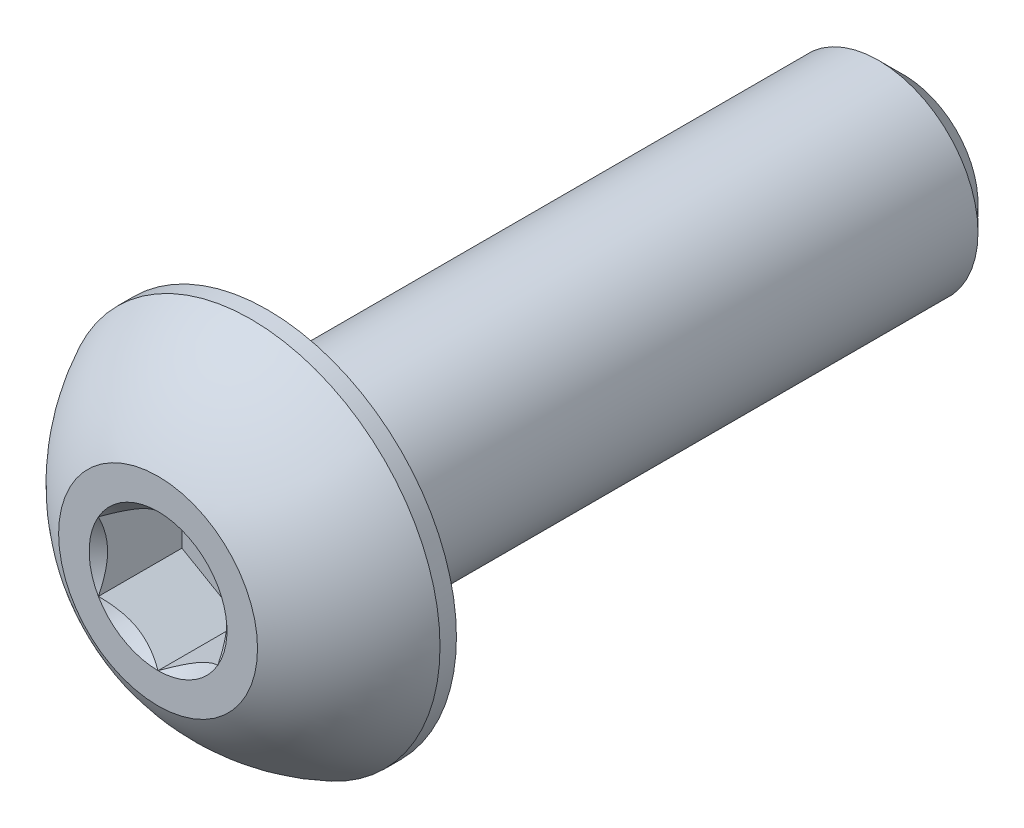
ISO-10303-21;
HEADER;
FILE_DESCRIPTION(('STEP AP214'),'2;1');
FILE_NAME('part.step','',(''),(''),'','','');
FILE_SCHEMA(('AUTOMOTIVE_DESIGN { 1 0 10303 214 1 1 1 1 }'));
ENDSEC;
DATA;
#1=APPLICATION_CONTEXT('core data for automotive mechanical design processes');
#2=APPLICATION_PROTOCOL_DEFINITION('international standard','automotive_design',2000,#1);
#3=PRODUCT_CONTEXT('',#1,'mechanical');
#4=PRODUCT('Part','Part','',(#3));
#5=PRODUCT_RELATED_PRODUCT_CATEGORY('part','',(#4));
#6=PRODUCT_DEFINITION_FORMATION('','',#4);
#7=PRODUCT_DEFINITION_CONTEXT('part definition',#1,'design');
#8=PRODUCT_DEFINITION('design','',#6,#7);
#9=PRODUCT_DEFINITION_SHAPE('','',#8);
#10=(LENGTH_UNIT() NAMED_UNIT(*) SI_UNIT(.MILLI.,.METRE.));
#11=(NAMED_UNIT(*) PLANE_ANGLE_UNIT() SI_UNIT($,.RADIAN.));
#12=(NAMED_UNIT(*) SI_UNIT($,.STERADIAN.) SOLID_ANGLE_UNIT());
#13=UNCERTAINTY_MEASURE_WITH_UNIT(LENGTH_MEASURE(1.E-05),#10,'distance_accuracy_value','');
#14=(GEOMETRIC_REPRESENTATION_CONTEXT(3) GLOBAL_UNCERTAINTY_ASSIGNED_CONTEXT((#13)) GLOBAL_UNIT_ASSIGNED_CONTEXT((#10,
#11,#12)) REPRESENTATION_CONTEXT('',''));
#15=CARTESIAN_POINT('',(0.,0.,0.));
#16=DIRECTION('',(0.,0.,1.));
#17=DIRECTION('',(1.,0.,0.));
#18=AXIS2_PLACEMENT_3D('',#15,#16,#17);
#19=CARTESIAN_POINT('',(1.5,0.866025403784439,7.275));
#20=DIRECTION('',(0.5,0.866025403784439,0.));
#21=DIRECTION('',(0.,0.,-1.));
#22=AXIS2_PLACEMENT_3D('',#19,#20,#21);
#23=PLANE('',#22);
#24=DIRECTION('',(0.,0.,1.));
#25=VECTOR('',#24,1.);
#26=CARTESIAN_POINT('',(1.5,0.866025403784439,7.275));
#27=LINE('',#26,#25);
#28=CARTESIAN_POINT('',(1.5,0.866025403784439,7.275));
#29=VERTEX_POINT('',#28);
#30=CARTESIAN_POINT('',(1.5,0.866025403784439,9.375));
#31=VERTEX_POINT('',#30);
#32=EDGE_CURVE('E11',#29,#31,#27,.T.);
#33=ORIENTED_EDGE('',*,*,#32,.T.);
#34=CARTESIAN_POINT('',(1.5,0.866025403784441,9.37499999999999));
#35=CARTESIAN_POINT('',(0.749999999999999,1.29903810567666,8.94198729810777));
#36=CARTESIAN_POINT('',(0.,1.73205080756888,9.375));
#37=(BOUNDED_CURVE() B_SPLINE_CURVE(2,(#34,#35,#36),.UNSPECIFIED.,.F.,
.F.) B_SPLINE_CURVE_WITH_KNOTS((3,3),(-0.38831280429231,-0.130611113351457),
.UNSPECIFIED.) CURVE() GEOMETRIC_REPRESENTATION_ITEM() RATIONAL_B_SPLINE_CURVE((1.30940107675851,
1.51196612828742,1.3094010767585)) REPRESENTATION_ITEM(''));
#38=CARTESIAN_POINT('',(0.,1.73205080756888,9.375));
#39=VERTEX_POINT('',#38);
#40=EDGE_CURVE('E124',#31,#39,#37,.T.);
#41=ORIENTED_EDGE('',*,*,#40,.T.);
#42=DIRECTION('',(0.,0.,1.));
#43=VECTOR('',#42,1.);
#44=CARTESIAN_POINT('',(0.,1.73205080756888,7.275));
#45=LINE('',#44,#43);
#46=CARTESIAN_POINT('',(0.,1.73205080756888,7.275));
#47=VERTEX_POINT('',#46);
#48=EDGE_CURVE('E202',#47,#39,#45,.T.);
#49=ORIENTED_EDGE('',*,*,#48,.F.);
#50=DIRECTION('',(-0.866025403784439,0.5,0.));
#51=VECTOR('',#50,1.);
#52=CARTESIAN_POINT('',(1.5,0.866025403784439,7.275));
#53=LINE('',#52,#51);
#54=EDGE_CURVE('E242',#29,#47,#53,.T.);
#55=ORIENTED_EDGE('',*,*,#54,.F.);
#56=EDGE_LOOP('',(#33,#41,#49,#55));
#57=FACE_BOUND('',#56,.T.);
#58=ADVANCED_FACE('F17',(#57),#23,.F.);
#59=CARTESIAN_POINT('',(1.5,-0.866025403784439,7.275));
#60=DIRECTION('',(1.,0.,0.));
#61=DIRECTION('',(0.,-1.,0.));
#62=AXIS2_PLACEMENT_3D('',#59,#60,#61);
#63=PLANE('',#62);
#64=DIRECTION('',(0.,0.,1.));
#65=VECTOR('',#64,1.);
#66=CARTESIAN_POINT('',(1.5,-0.866025403784439,7.275));
#67=LINE('',#66,#65);
#68=CARTESIAN_POINT('',(1.5,-0.866025403784439,7.275));
#69=VERTEX_POINT('',#68);
#70=CARTESIAN_POINT('',(1.5,-0.866025403784439,9.375));
#71=VERTEX_POINT('',#70);
#72=EDGE_CURVE('E20',#69,#71,#67,.T.);
#73=ORIENTED_EDGE('',*,*,#72,.T.);
#74=CARTESIAN_POINT('',(1.5,-0.86602540378444,9.375));
#75=CARTESIAN_POINT('',(1.5,0.,8.94198729810777));
#76=CARTESIAN_POINT('',(1.5,0.86602540378444,9.375));
#77=(BOUNDED_CURVE() B_SPLINE_CURVE(2,(#74,#75,#76),.UNSPECIFIED.,.F.,
.F.) B_SPLINE_CURVE_WITH_KNOTS((3,3),(-0.388312804292311,-0.130611113351457),
.UNSPECIFIED.) CURVE() GEOMETRIC_REPRESENTATION_ITEM() RATIONAL_B_SPLINE_CURVE((1.3094010767585,
1.51196612828742,1.3094010767585)) REPRESENTATION_ITEM(''));
#78=EDGE_CURVE('E113',#71,#31,#77,.T.);
#79=ORIENTED_EDGE('',*,*,#78,.T.);
#80=ORIENTED_EDGE('',*,*,#32,.F.);
#81=DIRECTION('',(0.,1.,0.));
#82=VECTOR('',#81,1.);
#83=CARTESIAN_POINT('',(1.5,-0.866025403784439,7.275));
#84=LINE('',#83,#82);
#85=EDGE_CURVE('E115',#69,#29,#84,.T.);
#86=ORIENTED_EDGE('',*,*,#85,.F.);
#87=EDGE_LOOP('',(#73,#79,#80,#86));
#88=FACE_BOUND('',#87,.T.);
#89=ADVANCED_FACE('F111',(#88),#63,.F.);
#90=CARTESIAN_POINT('',(0.,-1.73205080756888,7.275));
#91=DIRECTION('',(0.5,-0.866025403784439,0.));
#92=DIRECTION('',(0.,0.,-1.));
#93=AXIS2_PLACEMENT_3D('',#90,#91,#92);
#94=PLANE('',#93);
#95=DIRECTION('',(0.,0.,1.));
#96=VECTOR('',#95,1.);
#97=CARTESIAN_POINT('',(0.,-1.73205080756888,7.275));
#98=LINE('',#97,#96);
#99=CARTESIAN_POINT('',(0.,-1.73205080756888,7.275));
#100=VERTEX_POINT('',#99);
#101=CARTESIAN_POINT('',(0.,-1.73205080756888,9.375));
#102=VERTEX_POINT('',#101);
#103=EDGE_CURVE('E47',#100,#102,#98,.T.);
#104=ORIENTED_EDGE('',*,*,#103,.T.);
#105=CARTESIAN_POINT('',(0.,-1.73205080756888,9.375));
#106=CARTESIAN_POINT('',(0.749999999999998,-1.29903810567666,8.94198729810777));
#107=CARTESIAN_POINT('',(1.5,-0.86602540378444,9.375));
#108=(BOUNDED_CURVE() B_SPLINE_CURVE(2,(#105,#106,#107),.UNSPECIFIED.,.F.,
.F.) B_SPLINE_CURVE_WITH_KNOTS((3,3),(-0.388312804292312,-0.130611113351457),
.UNSPECIFIED.) CURVE() GEOMETRIC_REPRESENTATION_ITEM() RATIONAL_B_SPLINE_CURVE((1.3094010767585,
1.51196612828742,1.3094010767585)) REPRESENTATION_ITEM(''));
#109=EDGE_CURVE('E119',#102,#71,#108,.T.);
#110=ORIENTED_EDGE('',*,*,#109,.T.);
#111=ORIENTED_EDGE('',*,*,#72,.F.);
#112=DIRECTION('',(0.866025403784439,0.5,0.));
#113=VECTOR('',#112,1.);
#114=CARTESIAN_POINT('',(0.,-1.73205080756888,7.275));
#115=LINE('',#114,#113);
#116=EDGE_CURVE('E261',#100,#69,#115,.T.);
#117=ORIENTED_EDGE('',*,*,#116,.F.);
#118=EDGE_LOOP('',(#104,#110,#111,#117));
#119=FACE_BOUND('',#118,.T.);
#120=ADVANCED_FACE('F121',(#119),#94,.F.);
#121=CARTESIAN_POINT('',(-1.5,-0.866025403784438,7.275));
#122=DIRECTION('',(-0.5,-0.866025403784439,0.));
#123=DIRECTION('',(-0.866025403784439,0.5,0.));
#124=AXIS2_PLACEMENT_3D('',#121,#122,#123);
#125=PLANE('',#124);
#126=DIRECTION('',(0.,0.,1.));
#127=VECTOR('',#126,1.);
#128=CARTESIAN_POINT('',(-1.5,-0.866025403784438,7.275));
#129=LINE('',#128,#127);
#130=CARTESIAN_POINT('',(-1.5,-0.866025403784438,7.275));
#131=VERTEX_POINT('',#130);
#132=CARTESIAN_POINT('',(-1.5,-0.866025403784439,9.375));
#133=VERTEX_POINT('',#132);
#134=EDGE_CURVE('E262',#131,#133,#129,.T.);
#135=ORIENTED_EDGE('',*,*,#134,.T.);
#136=CARTESIAN_POINT('',(-1.5,-0.866025403784438,9.375));
#137=CARTESIAN_POINT('',(-0.749999999999999,-1.29903810567666,8.94198729810777));
#138=CARTESIAN_POINT('',(0.,-1.73205080756888,9.375));
#139=(BOUNDED_CURVE() B_SPLINE_CURVE(2,(#136,#137,#138),.UNSPECIFIED.,.F.,
.F.) B_SPLINE_CURVE_WITH_KNOTS((3,3),(-0.388312804292311,-0.130611113351457),
.UNSPECIFIED.) CURVE() GEOMETRIC_REPRESENTATION_ITEM() RATIONAL_B_SPLINE_CURVE((1.3094010767585,
1.51196612828742,1.3094010767585)) REPRESENTATION_ITEM(''));
#140=EDGE_CURVE('E125',#133,#102,#139,.T.);
#141=ORIENTED_EDGE('',*,*,#140,.T.);
#142=ORIENTED_EDGE('',*,*,#103,.F.);
#143=DIRECTION('',(0.866025403784439,-0.5,0.));
#144=VECTOR('',#143,1.);
#145=CARTESIAN_POINT('',(-1.5,-0.866025403784438,7.275));
#146=LINE('',#145,#144);
#147=EDGE_CURVE('E257',#131,#100,#146,.T.);
#148=ORIENTED_EDGE('',*,*,#147,.F.);
#149=EDGE_LOOP('',(#135,#141,#142,#148));
#150=FACE_BOUND('',#149,.T.);
#151=ADVANCED_FACE('F524',(#150),#125,.F.);
#152=CARTESIAN_POINT('',(-1.5,0.866025403784439,7.275));
#153=DIRECTION('',(-1.,0.,0.));
#154=DIRECTION('',(0.,0.,1.));
#155=AXIS2_PLACEMENT_3D('',#152,#153,#154);
#156=PLANE('',#155);
#157=DIRECTION('',(0.,0.,1.));
#158=VECTOR('',#157,1.);
#159=CARTESIAN_POINT('',(-1.5,0.866025403784439,7.275));
#160=LINE('',#159,#158);
#161=CARTESIAN_POINT('',(-1.5,0.866025403784439,7.275));
#162=VERTEX_POINT('',#161);
#163=CARTESIAN_POINT('',(-1.5,0.866025403784439,9.375));
#164=VERTEX_POINT('',#163);
#165=EDGE_CURVE('E205',#162,#164,#160,.T.);
#166=ORIENTED_EDGE('',*,*,#165,.T.);
#167=CARTESIAN_POINT('',(-1.5,0.866025403784437,9.375));
#168=CARTESIAN_POINT('',(-1.5,0.,8.94198729810777));
#169=CARTESIAN_POINT('',(-1.5,-0.866025403784438,9.375));
#170=(BOUNDED_CURVE() B_SPLINE_CURVE(2,(#167,#168,#169),.UNSPECIFIED.,.F.,
.F.) B_SPLINE_CURVE_WITH_KNOTS((3,3),(-0.388312804292311,-0.130611113351457),
.UNSPECIFIED.) CURVE() GEOMETRIC_REPRESENTATION_ITEM() RATIONAL_B_SPLINE_CURVE((1.3094010767585,
1.51196612828742,1.3094010767585)) REPRESENTATION_ITEM(''));
#171=EDGE_CURVE('E213',#164,#133,#170,.T.);
#172=ORIENTED_EDGE('',*,*,#171,.T.);
#173=ORIENTED_EDGE('',*,*,#134,.F.);
#174=DIRECTION('',(0.,-1.,0.));
#175=VECTOR('',#174,1.);
#176=CARTESIAN_POINT('',(-1.5,0.866025403784439,7.275));
#177=LINE('',#176,#175);
#178=EDGE_CURVE('E253',#162,#131,#177,.T.);
#179=ORIENTED_EDGE('',*,*,#178,.F.);
#180=EDGE_LOOP('',(#166,#172,#173,#179));
#181=FACE_BOUND('',#180,.T.);
#182=ADVANCED_FACE('F515',(#181),#156,.F.);
#183=CARTESIAN_POINT('',(0.,1.73205080756888,7.275));
#184=DIRECTION('',(-0.5,0.866025403784439,0.));
#185=DIRECTION('',(0.,0.,1.));
#186=AXIS2_PLACEMENT_3D('',#183,#184,#185);
#187=PLANE('',#186);
#188=ORIENTED_EDGE('',*,*,#48,.T.);
#189=CARTESIAN_POINT('',(0.,1.73205080756888,9.375));
#190=CARTESIAN_POINT('',(-0.749999999999999,1.29903810567666,8.94198729810777));
#191=CARTESIAN_POINT('',(-1.5,0.86602540378444,9.375));
#192=(BOUNDED_CURVE() B_SPLINE_CURVE(2,(#189,#190,#191),.UNSPECIFIED.,.F.,
.F.) B_SPLINE_CURVE_WITH_KNOTS((3,3),(-0.388312804292311,-0.130611113351457),
.UNSPECIFIED.) CURVE() GEOMETRIC_REPRESENTATION_ITEM() RATIONAL_B_SPLINE_CURVE((1.3094010767585,
1.51196612828742,1.3094010767585)) REPRESENTATION_ITEM(''));
#193=EDGE_CURVE('E190',#39,#164,#192,.T.);
#194=ORIENTED_EDGE('',*,*,#193,.T.);
#195=ORIENTED_EDGE('',*,*,#165,.F.);
#196=DIRECTION('',(-0.866025403784439,-0.5,0.));
#197=VECTOR('',#196,1.);
#198=CARTESIAN_POINT('',(0.,1.73205080756888,7.275));
#199=LINE('',#198,#197);
#200=EDGE_CURVE('E249',#47,#162,#199,.T.);
#201=ORIENTED_EDGE('',*,*,#200,.F.);
#202=EDGE_LOOP('',(#188,#194,#195,#201));
#203=FACE_BOUND('',#202,.T.);
#204=ADVANCED_FACE('F505',(#203),#187,.F.);
#205=CARTESIAN_POINT('',(0.,0.,7.275));
#206=DIRECTION('',(0.,0.,1.));
#207=DIRECTION('',(1.,0.,0.));
#208=AXIS2_PLACEMENT_3D('',#205,#206,#207);
#209=PLANE('',#208);
#210=ORIENTED_EDGE('',*,*,#54,.T.);
#211=ORIENTED_EDGE('',*,*,#200,.T.);
#212=ORIENTED_EDGE('',*,*,#178,.T.);
#213=ORIENTED_EDGE('',*,*,#147,.T.);
#214=ORIENTED_EDGE('',*,*,#116,.T.);
#215=ORIENTED_EDGE('',*,*,#85,.T.);
#216=EDGE_LOOP('',(#210,#211,#212,#213,#214,#215));
#217=FACE_BOUND('',#216,.T.);
#218=ADVANCED_FACE('F496',(#217),#209,.T.);
#219=CARTESIAN_POINT('',(0.,0.,9.375));
#220=DIRECTION('',(0.,0.,1.));
#221=DIRECTION('',(1.,0.,0.));
#222=AXIS2_PLACEMENT_3D('',#219,#220,#221);
#223=CONICAL_SURFACE('',#222,1.73205080756888,0.78539816339745);
#224=CARTESIAN_POINT('',(0.,0.,9.375));
#225=DIRECTION('',(0.,0.,1.));
#226=DIRECTION('',(1.,0.,0.));
#227=AXIS2_PLACEMENT_3D('',#224,#225,#226);
#228=CIRCLE('',#227,1.73205080756888);
#229=EDGE_CURVE('E135',#31,#39,#228,.T.);
#230=ORIENTED_EDGE('',*,*,#229,.T.);
#231=ORIENTED_EDGE('',*,*,#40,.F.);
#232=EDGE_LOOP('',(#230,#231));
#233=FACE_BOUND('',#232,.T.);
#234=ADVANCED_FACE('F487',(#233),#223,.F.);
#235=CARTESIAN_POINT('',(0.,0.,9.375));
#236=DIRECTION('',(0.,0.,1.));
#237=DIRECTION('',(1.,0.,0.));
#238=AXIS2_PLACEMENT_3D('',#235,#236,#237);
#239=CONICAL_SURFACE('',#238,1.73205080756888,0.78539816339745);
#240=CARTESIAN_POINT('',(0.,0.,9.375));
#241=DIRECTION('',(0.,0.,1.));
#242=DIRECTION('',(1.,0.,0.));
#243=AXIS2_PLACEMENT_3D('',#240,#241,#242);
#244=CIRCLE('',#243,1.73205080756888);
#245=EDGE_CURVE('E128',#102,#71,#244,.T.);
#246=ORIENTED_EDGE('',*,*,#245,.T.);
#247=ORIENTED_EDGE('',*,*,#109,.F.);
#248=EDGE_LOOP('',(#246,#247));
#249=FACE_BOUND('',#248,.T.);
#250=ADVANCED_FACE('F130',(#249),#239,.F.);
#251=CARTESIAN_POINT('',(0.,0.,9.375));
#252=DIRECTION('',(0.,0.,1.));
#253=DIRECTION('',(1.,0.,0.));
#254=AXIS2_PLACEMENT_3D('',#251,#252,#253);
#255=CONICAL_SURFACE('',#254,1.73205080756888,0.78539816339745);
#256=CARTESIAN_POINT('',(0.,0.,9.375));
#257=DIRECTION('',(0.,0.,1.));
#258=DIRECTION('',(1.,0.,0.));
#259=AXIS2_PLACEMENT_3D('',#256,#257,#258);
#260=CIRCLE('',#259,1.73205080756888);
#261=EDGE_CURVE('E134',#133,#102,#260,.T.);
#262=ORIENTED_EDGE('',*,*,#261,.T.);
#263=ORIENTED_EDGE('',*,*,#140,.F.);
#264=EDGE_LOOP('',(#262,#263));
#265=FACE_BOUND('',#264,.T.);
#266=ADVANCED_FACE('F470',(#265),#255,.F.);
#267=CARTESIAN_POINT('',(0.,0.,9.375));
#268=DIRECTION('',(0.,0.,1.));
#269=DIRECTION('',(-1.,0.,0.));
#270=AXIS2_PLACEMENT_3D('',#267,#268,#269);
#271=CONICAL_SURFACE('',#270,1.73205080756888,0.78539816339745);
#272=CARTESIAN_POINT('',(0.,0.,9.375));
#273=DIRECTION('',(0.,0.,1.));
#274=DIRECTION('',(1.,0.,0.));
#275=AXIS2_PLACEMENT_3D('',#272,#273,#274);
#276=CIRCLE('',#275,1.73205080756888);
#277=EDGE_CURVE('E184',#164,#133,#276,.T.);
#278=ORIENTED_EDGE('',*,*,#277,.T.);
#279=ORIENTED_EDGE('',*,*,#171,.F.);
#280=EDGE_LOOP('',(#278,#279));
#281=FACE_BOUND('',#280,.T.);
#282=ADVANCED_FACE('F460',(#281),#271,.F.);
#283=CARTESIAN_POINT('',(0.,0.,9.375));
#284=DIRECTION('',(0.,0.,1.));
#285=DIRECTION('',(1.,0.,0.));
#286=AXIS2_PLACEMENT_3D('',#283,#284,#285);
#287=CONICAL_SURFACE('',#286,1.73205080756888,0.78539816339745);
#288=CARTESIAN_POINT('',(0.,0.,9.375));
#289=DIRECTION('',(0.,0.,1.));
#290=DIRECTION('',(1.,0.,0.));
#291=AXIS2_PLACEMENT_3D('',#288,#289,#290);
#292=CIRCLE('',#291,1.73205080756888);
#293=EDGE_CURVE('E164',#39,#164,#292,.T.);
#294=ORIENTED_EDGE('',*,*,#293,.T.);
#295=ORIENTED_EDGE('',*,*,#193,.F.);
#296=EDGE_LOOP('',(#294,#295));
#297=FACE_BOUND('',#296,.T.);
#298=ADVANCED_FACE('F449',(#297),#287,.F.);
#299=CARTESIAN_POINT('',(0.,0.,-9.375));
#300=DIRECTION('',(0.,0.,1.));
#301=DIRECTION('',(1.,0.,0.));
#302=AXIS2_PLACEMENT_3D('',#299,#300,#301);
#303=PLANE('',#302);
#304=CARTESIAN_POINT('',(0.,0.,-9.375));
#305=DIRECTION('',(0.,0.,1.));
#306=DIRECTION('',(1.,0.,0.));
#307=AXIS2_PLACEMENT_3D('',#304,#305,#306);
#308=CIRCLE('',#307,1.86);
#309=CARTESIAN_POINT('',(-1.86,0.,-9.375));
#310=VERTEX_POINT('',#309);
#311=EDGE_CURVE('E170',#310,#310,#308,.T.);
#312=ORIENTED_EDGE('',*,*,#311,.F.);
#313=EDGE_LOOP('',(#312));
#314=FACE_BOUND('',#313,.T.);
#315=ADVANCED_FACE('F439',(#314),#303,.F.);
#316=CARTESIAN_POINT('',(0.,2.5,6.625));
#317=DIRECTION('',(0.,0.,1.));
#318=DIRECTION('',(1.,0.,0.));
#319=AXIS2_PLACEMENT_3D('',#316,#317,#318);
#320=PLANE('',#319);
#321=CARTESIAN_POINT('',(0.,0.,6.625));
#322=DIRECTION('',(0.,0.,1.));
#323=DIRECTION('',(1.,0.,0.));
#324=AXIS2_PLACEMENT_3D('',#321,#322,#323);
#325=CIRCLE('',#324,2.5);
#326=CARTESIAN_POINT('',(-2.5,0.,6.625));
#327=VERTEX_POINT('',#326);
#328=EDGE_CURVE('E176',#327,#327,#325,.T.);
#329=ORIENTED_EDGE('',*,*,#328,.T.);
#330=EDGE_LOOP('',(#329));
#331=FACE_BOUND('',#330,.T.);
#332=CARTESIAN_POINT('',(0.,0.,6.625));
#333=DIRECTION('',(0.,0.,1.));
#334=DIRECTION('',(1.,0.,0.));
#335=AXIS2_PLACEMENT_3D('',#332,#333,#334);
#336=CIRCLE('',#335,4.75);
#337=CARTESIAN_POINT('',(-4.75,0.,6.625));
#338=VERTEX_POINT('',#337);
#339=EDGE_CURVE('E195',#338,#338,#336,.T.);
#340=ORIENTED_EDGE('',*,*,#339,.F.);
#341=EDGE_LOOP('',(#340));
#342=FACE_BOUND('',#341,.T.);
#343=ADVANCED_FACE('F430',(#331,#342),#320,.F.);
#344=CARTESIAN_POINT('',(0.,0.,9.375));
#345=DIRECTION('',(0.,0.,-1.));
#346=DIRECTION('',(0.,-1.,0.));
#347=AXIS2_PLACEMENT_3D('',#344,#345,#346);
#348=PLANE('',#347);
#349=ORIENTED_EDGE('',*,*,#277,.F.);
#350=ORIENTED_EDGE('',*,*,#293,.F.);
#351=ORIENTED_EDGE('',*,*,#229,.F.);
#352=CARTESIAN_POINT('',(0.,0.,9.375));
#353=DIRECTION('',(0.,0.,1.));
#354=DIRECTION('',(1.,0.,0.));
#355=AXIS2_PLACEMENT_3D('',#352,#353,#354);
#356=CIRCLE('',#355,1.73205080756888);
#357=EDGE_CURVE('E139',#71,#31,#356,.T.);
#358=ORIENTED_EDGE('',*,*,#357,.F.);
#359=ORIENTED_EDGE('',*,*,#245,.F.);
#360=ORIENTED_EDGE('',*,*,#261,.F.);
#361=EDGE_LOOP('',(#349,#350,#351,#358,#359,#360));
#362=FACE_BOUND('',#361,.T.);
#363=CARTESIAN_POINT('',(0.,0.,9.375));
#364=DIRECTION('',(0.,0.,1.));
#365=DIRECTION('',(1.,0.,0.));
#366=AXIS2_PLACEMENT_3D('',#363,#364,#365);
#367=CIRCLE('',#366,2.5);
#368=CARTESIAN_POINT('',(0.,2.5,9.375));
#369=VERTEX_POINT('',#368);
#370=EDGE_CURVE('E198',#369,#369,#367,.T.);
#371=ORIENTED_EDGE('',*,*,#370,.T.);
#372=EDGE_LOOP('',(#371));
#373=FACE_BOUND('',#372,.T.);
#374=ADVANCED_FACE('F141',(#362,#373),#348,.F.);
#375=CARTESIAN_POINT('',(0.,0.,4.71694518716577));
#376=DIRECTION('',(-1.,0.,0.));
#377=DIRECTION('',(0.,1.,0.));
#378=AXIS2_PLACEMENT_3D('',#375,#376,#377);
#379=SPHERICAL_SURFACE('',#378,5.28653711226622);
#380=CARTESIAN_POINT('',(0.,0.,4.71694518716577));
#381=DIRECTION('',(0.,0.,1.));
#382=DIRECTION('',(1.,0.,0.));
#383=AXIS2_PLACEMENT_3D('',#380,#381,#382);
#384=SPHERICAL_SURFACE('',#383,5.28653711226622);
#385=ORIENTED_EDGE('',*,*,#370,.F.);
#386=EDGE_LOOP('',(#385));
#387=FACE_BOUND('',#386,.T.);
#388=CARTESIAN_POINT('',(0.,0.,7.0375));
#389=DIRECTION('',(0.,0.,1.));
#390=DIRECTION('',(1.,0.,0.));
#391=AXIS2_PLACEMENT_3D('',#388,#389,#390);
#392=CIRCLE('',#391,4.75);
#393=CARTESIAN_POINT('',(-4.75,0.,7.0375));
#394=VERTEX_POINT('',#393);
#395=EDGE_CURVE('E187',#394,#394,#392,.T.);
#396=ORIENTED_EDGE('',*,*,#395,.T.);
#397=EDGE_LOOP('',(#396));
#398=FACE_BOUND('',#397,.T.);
#399=ADVANCED_FACE('F408',(#387,#398),#384,.T.);
#400=CARTESIAN_POINT('',(0.,0.,9.375));
#401=DIRECTION('',(0.,0.,1.));
#402=DIRECTION('',(1.,0.,0.));
#403=AXIS2_PLACEMENT_3D('',#400,#401,#402);
#404=CYLINDRICAL_SURFACE('',#403,4.75);
#405=ORIENTED_EDGE('',*,*,#395,.F.);
#406=DIRECTION('',(0.,0.,-1.));
#407=VECTOR('',#406,1.);
#408=CARTESIAN_POINT('',(-4.75,0.,9.375));
#409=LINE('',#408,#407);
#410=EDGE_CURVE('E158',#394,#338,#409,.T.);
#411=ORIENTED_EDGE('',*,*,#410,.T.);
#412=ORIENTED_EDGE('',*,*,#339,.T.);
#413=ORIENTED_EDGE('',*,*,#410,.F.);
#414=EDGE_LOOP('',(#405,#411,#412,#413));
#415=FACE_BOUND('',#414,.T.);
#416=ADVANCED_FACE('F397',(#415),#404,.T.);
#417=CARTESIAN_POINT('',(0.,0.,9.375));
#418=DIRECTION('',(0.,0.,1.));
#419=DIRECTION('',(1.,0.,0.));
#420=AXIS2_PLACEMENT_3D('',#417,#418,#419);
#421=CYLINDRICAL_SURFACE('',#420,2.5);
#422=ORIENTED_EDGE('',*,*,#328,.F.);
#423=DIRECTION('',(0.,0.,-1.));
#424=VECTOR('',#423,1.);
#425=CARTESIAN_POINT('',(-2.5,0.,9.375));
#426=LINE('',#425,#424);
#427=CARTESIAN_POINT('',(-2.5,0.,-8.735));
#428=VERTEX_POINT('',#427);
#429=EDGE_CURVE('E180',#327,#428,#426,.T.);
#430=ORIENTED_EDGE('',*,*,#429,.T.);
#431=CARTESIAN_POINT('',(0.,0.,-8.735));
#432=DIRECTION('',(0.,0.,1.));
#433=DIRECTION('',(1.,0.,0.));
#434=AXIS2_PLACEMENT_3D('',#431,#432,#433);
#435=CIRCLE('',#434,2.5);
#436=EDGE_CURVE('E147',#428,#428,#435,.T.);
#437=ORIENTED_EDGE('',*,*,#436,.T.);
#438=ORIENTED_EDGE('',*,*,#429,.F.);
#439=EDGE_LOOP('',(#422,#430,#437,#438));
#440=FACE_BOUND('',#439,.T.);
#441=ADVANCED_FACE('F387',(#440),#421,.T.);
#442=CARTESIAN_POINT('',(0.,0.,-9.375));
#443=DIRECTION('',(0.,0.,1.));
#444=DIRECTION('',(1.,0.,0.));
#445=AXIS2_PLACEMENT_3D('',#442,#443,#444);
#446=CONICAL_SURFACE('',#445,1.86,0.785398163397444);
#447=ORIENTED_EDGE('',*,*,#436,.F.);
#448=DIRECTION('',(0.707106781186544,0.,-0.707106781186551));
#449=VECTOR('',#448,1.);
#450=CARTESIAN_POINT('',(-1.86,0.,-9.375));
#451=LINE('',#450,#449);
#452=EDGE_CURVE('E166',#428,#310,#451,.T.);
#453=ORIENTED_EDGE('',*,*,#452,.T.);
#454=ORIENTED_EDGE('',*,*,#311,.T.);
#455=ORIENTED_EDGE('',*,*,#452,.F.);
#456=EDGE_LOOP('',(#447,#453,#454,#455));
#457=FACE_BOUND('',#456,.T.);
#458=ADVANCED_FACE('F377',(#457),#446,.T.);
#459=CARTESIAN_POINT('',(0.,0.,9.375));
#460=DIRECTION('',(0.,0.,1.));
#461=DIRECTION('',(1.,0.,0.));
#462=AXIS2_PLACEMENT_3D('',#459,#460,#461);
#463=CONICAL_SURFACE('',#462,1.73205080756888,0.78539816339745);
#464=ORIENTED_EDGE('',*,*,#78,.F.);
#465=ORIENTED_EDGE('',*,*,#357,.T.);
#466=EDGE_LOOP('',(#464,#465));
#467=FACE_BOUND('',#466,.T.);
#468=ADVANCED_FACE('F149',(#467),#463,.F.);
#469=CLOSED_SHELL('',(#58,#89,#120,#151,#182,#204,#218,#234,#250,#266,#282,#298,#315,#343,#374,
#399,#416,#441,#458,#468));
#470=MANIFOLD_SOLID_BREP('B1',#469);
#471=ADVANCED_BREP_SHAPE_REPRESENTATION('',(#18,#470),#14);
#472=SHAPE_DEFINITION_REPRESENTATION(#9,#471);
ENDSEC;
END-ISO-10303-21;
